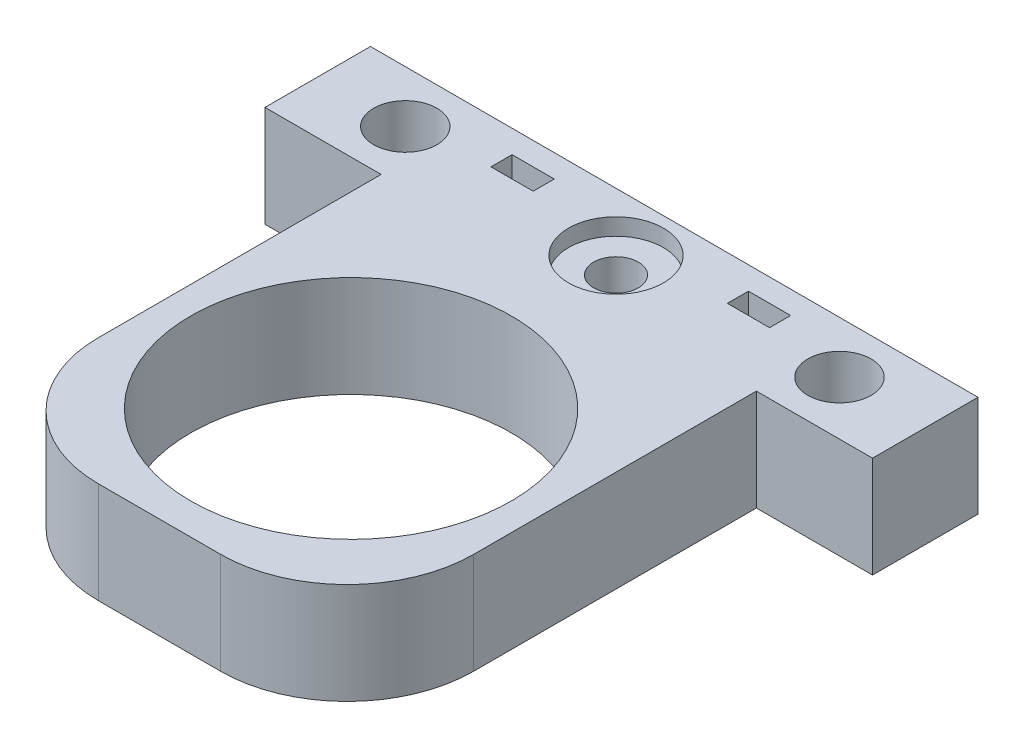
ISO-10303-21;
HEADER;
FILE_DESCRIPTION(('STEP AP214'),'2;1');
FILE_NAME('part.step','',(''),(''),'','','');
FILE_SCHEMA(('AUTOMOTIVE_DESIGN { 1 0 10303 214 1 1 1 1 }'));
ENDSEC;
DATA;
#1=APPLICATION_CONTEXT('core data for automotive mechanical design processes');
#2=APPLICATION_PROTOCOL_DEFINITION('international standard','automotive_design',2000,#1);
#3=PRODUCT_CONTEXT('',#1,'mechanical');
#4=PRODUCT('Part','Part','',(#3));
#5=PRODUCT_RELATED_PRODUCT_CATEGORY('part','',(#4));
#6=PRODUCT_DEFINITION_FORMATION('','',#4);
#7=PRODUCT_DEFINITION_CONTEXT('part definition',#1,'design');
#8=PRODUCT_DEFINITION('design','',#6,#7);
#9=PRODUCT_DEFINITION_SHAPE('','',#8);
#10=(LENGTH_UNIT() NAMED_UNIT(*) SI_UNIT(.MILLI.,.METRE.));
#11=(NAMED_UNIT(*) PLANE_ANGLE_UNIT() SI_UNIT($,.RADIAN.));
#12=(NAMED_UNIT(*) SI_UNIT($,.STERADIAN.) SOLID_ANGLE_UNIT());
#13=UNCERTAINTY_MEASURE_WITH_UNIT(LENGTH_MEASURE(1.E-05),#10,'distance_accuracy_value','');
#14=(GEOMETRIC_REPRESENTATION_CONTEXT(3) GLOBAL_UNCERTAINTY_ASSIGNED_CONTEXT((#13)) GLOBAL_UNIT_ASSIGNED_CONTEXT((#10,
#11,#12)) REPRESENTATION_CONTEXT('',''));
#15=CARTESIAN_POINT('',(0.,0.,0.));
#16=DIRECTION('',(0.,0.,1.));
#17=DIRECTION('',(1.,0.,0.));
#18=AXIS2_PLACEMENT_3D('',#15,#16,#17);
#19=CARTESIAN_POINT('',(0.,20.,-11.2));
#20=DIRECTION('',(0.,1.,0.));
#21=DIRECTION('',(0.,0.,1.));
#22=AXIS2_PLACEMENT_3D('',#19,#20,#21);
#23=CYLINDRICAL_SURFACE('',#22,5.3);
#24=CARTESIAN_POINT('',(0.,20.,-11.2));
#25=DIRECTION('',(0.,1.,0.));
#26=DIRECTION('',(0.,0.,1.));
#27=AXIS2_PLACEMENT_3D('',#24,#25,#26);
#28=CIRCLE('',#27,5.3);
#29=CARTESIAN_POINT('',(0.,20.,-5.90000000000002));
#30=VERTEX_POINT('',#29);
#31=EDGE_CURVE('E172',#30,#30,#28,.T.);
#32=ORIENTED_EDGE('',*,*,#31,.F.);
#33=EDGE_LOOP('',(#32));
#34=FACE_BOUND('',#33,.T.);
#35=CARTESIAN_POINT('',(0.,40.,-11.2));
#36=DIRECTION('',(0.,1.,0.));
#37=DIRECTION('',(0.,0.,1.));
#38=AXIS2_PLACEMENT_3D('',#35,#36,#37);
#39=CIRCLE('',#38,5.3);
#40=CARTESIAN_POINT('',(0.,40.,-5.90000000000002));
#41=VERTEX_POINT('',#40);
#42=EDGE_CURVE('E266',#41,#41,#39,.F.);
#43=ORIENTED_EDGE('',*,*,#42,.F.);
#44=EDGE_LOOP('',(#43));
#45=FACE_BOUND('',#44,.T.);
#46=ADVANCED_FACE('F38',(#34,#45),#23,.F.);
#47=CARTESIAN_POINT('',(-65.,60.,-25.));
#48=DIRECTION('',(0.,0.,1.));
#49=DIRECTION('',(1.,0.,0.));
#50=AXIS2_PLACEMENT_3D('',#47,#48,#49);
#51=PLANE('',#50);
#52=DIRECTION('',(-1.,0.,0.));
#53=VECTOR('',#52,1.);
#54=CARTESIAN_POINT('',(-72.,44.,-25.));
#55=LINE('',#54,#53);
#56=CARTESIAN_POINT('',(72.,44.,-25.));
#57=VERTEX_POINT('',#56);
#58=CARTESIAN_POINT('',(-72.,44.,-25.));
#59=VERTEX_POINT('',#58);
#60=EDGE_CURVE('E168',#57,#59,#55,.T.);
#61=ORIENTED_EDGE('',*,*,#60,.F.);
#62=DIRECTION('',(0.,1.,0.));
#63=VECTOR('',#62,1.);
#64=CARTESIAN_POINT('',(72.,60.,-25.));
#65=LINE('',#64,#63);
#66=CARTESIAN_POINT('',(72.,20.,-25.));
#67=VERTEX_POINT('',#66);
#68=EDGE_CURVE('E198',#67,#57,#65,.T.);
#69=ORIENTED_EDGE('',*,*,#68,.F.);
#70=DIRECTION('',(1.,0.,0.));
#71=VECTOR('',#70,1.);
#72=CARTESIAN_POINT('',(-65.,20.,-25.));
#73=LINE('',#72,#71);
#74=CARTESIAN_POINT('',(-72.,20.,-25.));
#75=VERTEX_POINT('',#74);
#76=EDGE_CURVE('E206',#75,#67,#73,.T.);
#77=ORIENTED_EDGE('',*,*,#76,.F.);
#78=DIRECTION('',(0.,-1.,0.));
#79=VECTOR('',#78,1.);
#80=CARTESIAN_POINT('',(-72.,60.,-25.));
#81=LINE('',#80,#79);
#82=EDGE_CURVE('E192',#59,#75,#81,.T.);
#83=ORIENTED_EDGE('',*,*,#82,.F.);
#84=EDGE_LOOP('',(#61,#69,#77,#83));
#85=FACE_BOUND('',#84,.T.);
#86=ADVANCED_FACE('F306',(#85),#51,.F.);
#87=CARTESIAN_POINT('',(51.4526055476511,0.,-12.7142223868873));
#88=DIRECTION('',(0.,1.,0.));
#89=DIRECTION('',(0.,0.,1.));
#90=AXIS2_PLACEMENT_3D('',#87,#88,#89);
#91=CYLINDRICAL_SURFACE('',#90,7.5);
#92=CARTESIAN_POINT('',(51.4526055476511,20.,-12.7142223868873));
#93=DIRECTION('',(0.,-1.,0.));
#94=DIRECTION('',(0.,0.,-1.));
#95=AXIS2_PLACEMENT_3D('',#92,#93,#94);
#96=CIRCLE('',#95,7.5);
#97=CARTESIAN_POINT('',(51.4526055476511,20.,-20.2142223868873));
#98=VERTEX_POINT('',#97);
#99=EDGE_CURVE('E229',#98,#98,#96,.F.);
#100=ORIENTED_EDGE('',*,*,#99,.F.);
#101=EDGE_LOOP('',(#100));
#102=FACE_BOUND('',#101,.T.);
#103=CARTESIAN_POINT('',(51.4526055476511,44.,-12.7142223868873));
#104=DIRECTION('',(0.,1.,0.));
#105=DIRECTION('',(0.,0.,1.));
#106=AXIS2_PLACEMENT_3D('',#103,#104,#105);
#107=CIRCLE('',#106,7.5);
#108=CARTESIAN_POINT('',(51.4526055476511,44.,-5.21422238688734));
#109=VERTEX_POINT('',#108);
#110=EDGE_CURVE('E334',#109,#109,#107,.F.);
#111=ORIENTED_EDGE('',*,*,#110,.F.);
#112=EDGE_LOOP('',(#111));
#113=FACE_BOUND('',#112,.T.);
#114=ADVANCED_FACE('F339',(#102,#113),#91,.F.);
#115=CARTESIAN_POINT('',(-51.4526055476511,0.,-12.7142223868873));
#116=DIRECTION('',(0.,1.,0.));
#117=DIRECTION('',(0.,0.,1.));
#118=AXIS2_PLACEMENT_3D('',#115,#116,#117);
#119=CYLINDRICAL_SURFACE('',#118,7.5);
#120=CARTESIAN_POINT('',(-51.4526055476511,20.,-12.7142223868873));
#121=DIRECTION('',(0.,-1.,0.));
#122=DIRECTION('',(0.,0.,-1.));
#123=AXIS2_PLACEMENT_3D('',#120,#121,#122);
#124=CIRCLE('',#123,7.5);
#125=CARTESIAN_POINT('',(-51.4526055476511,20.,-20.2142223868873));
#126=VERTEX_POINT('',#125);
#127=EDGE_CURVE('E226',#126,#126,#124,.F.);
#128=ORIENTED_EDGE('',*,*,#127,.F.);
#129=EDGE_LOOP('',(#128));
#130=FACE_BOUND('',#129,.T.);
#131=CARTESIAN_POINT('',(-51.4526055476511,44.,-12.7142223868873));
#132=DIRECTION('',(0.,1.,0.));
#133=DIRECTION('',(0.,0.,1.));
#134=AXIS2_PLACEMENT_3D('',#131,#132,#133);
#135=CIRCLE('',#134,7.5);
#136=CARTESIAN_POINT('',(-51.4526055476511,44.,-5.21422238688734));
#137=VERTEX_POINT('',#136);
#138=EDGE_CURVE('E331',#137,#137,#135,.F.);
#139=ORIENTED_EDGE('',*,*,#138,.F.);
#140=EDGE_LOOP('',(#139));
#141=FACE_BOUND('',#140,.T.);
#142=ADVANCED_FACE('F341',(#130,#141),#119,.F.);
#143=CARTESIAN_POINT('',(-33.01308524261,0.,-19.5794065637342));
#144=DIRECTION('',(-1.,0.,0.));
#145=DIRECTION('',(0.,0.,1.));
#146=AXIS2_PLACEMENT_3D('',#143,#144,#145);
#147=PLANE('',#146);
#148=DIRECTION('',(0.,0.,-1.));
#149=VECTOR('',#148,1.);
#150=CARTESIAN_POINT('',(-33.01308524261,44.,-19.5794065637342));
#151=LINE('',#150,#149);
#152=CARTESIAN_POINT('',(-33.01308524261,44.,-14.5794065637342));
#153=VERTEX_POINT('',#152);
#154=CARTESIAN_POINT('',(-33.01308524261,44.,-19.5794065637342));
#155=VERTEX_POINT('',#154);
#156=EDGE_CURVE('E329',#153,#155,#151,.T.);
#157=ORIENTED_EDGE('',*,*,#156,.F.);
#158=DIRECTION('',(0.,1.,0.));
#159=VECTOR('',#158,1.);
#160=CARTESIAN_POINT('',(-33.01308524261,0.,-14.5794065637342));
#161=LINE('',#160,#159);
#162=CARTESIAN_POINT('',(-33.01308524261,20.,-14.5794065637342));
#163=VERTEX_POINT('',#162);
#164=EDGE_CURVE('E236',#163,#153,#161,.T.);
#165=ORIENTED_EDGE('',*,*,#164,.F.);
#166=DIRECTION('',(0.,0.,1.));
#167=VECTOR('',#166,1.);
#168=CARTESIAN_POINT('',(-33.01308524261,20.,-19.5794065637342));
#169=LINE('',#168,#167);
#170=CARTESIAN_POINT('',(-33.01308524261,20.,-19.5794065637342));
#171=VERTEX_POINT('',#170);
#172=EDGE_CURVE('E224',#171,#163,#169,.T.);
#173=ORIENTED_EDGE('',*,*,#172,.F.);
#174=DIRECTION('',(0.,1.,0.));
#175=VECTOR('',#174,1.);
#176=CARTESIAN_POINT('',(-33.01308524261,0.,-19.5794065637342));
#177=LINE('',#176,#175);
#178=EDGE_CURVE('E245',#171,#155,#177,.T.);
#179=ORIENTED_EDGE('',*,*,#178,.T.);
#180=EDGE_LOOP('',(#157,#165,#173,#179));
#181=FACE_BOUND('',#180,.T.);
#182=ADVANCED_FACE('F348',(#181),#147,.F.);
#183=CARTESIAN_POINT('',(-33.01308524261,0.,-19.5794065637342));
#184=DIRECTION('',(0.,0.,-1.));
#185=DIRECTION('',(-1.,0.,0.));
#186=AXIS2_PLACEMENT_3D('',#183,#184,#185);
#187=PLANE('',#186);
#188=DIRECTION('',(1.,0.,0.));
#189=VECTOR('',#188,1.);
#190=CARTESIAN_POINT('',(-33.01308524261,44.,-19.5794065637342));
#191=LINE('',#190,#189);
#192=CARTESIAN_POINT('',(-23.01308524261,44.,-19.5794065637342));
#193=VERTEX_POINT('',#192);
#194=EDGE_CURVE('E327',#155,#193,#191,.T.);
#195=ORIENTED_EDGE('',*,*,#194,.F.);
#196=ORIENTED_EDGE('',*,*,#178,.F.);
#197=DIRECTION('',(-1.,0.,0.));
#198=VECTOR('',#197,1.);
#199=CARTESIAN_POINT('',(-33.01308524261,20.,-19.5794065637342));
#200=LINE('',#199,#198);
#201=CARTESIAN_POINT('',(-23.01308524261,20.,-19.5794065637342));
#202=VERTEX_POINT('',#201);
#203=EDGE_CURVE('E222',#202,#171,#200,.T.);
#204=ORIENTED_EDGE('',*,*,#203,.F.);
#205=DIRECTION('',(0.,1.,0.));
#206=VECTOR('',#205,1.);
#207=CARTESIAN_POINT('',(-23.01308524261,0.,-19.5794065637342));
#208=LINE('',#207,#206);
#209=EDGE_CURVE('E249',#202,#193,#208,.T.);
#210=ORIENTED_EDGE('',*,*,#209,.T.);
#211=EDGE_LOOP('',(#195,#196,#204,#210));
#212=FACE_BOUND('',#211,.T.);
#213=ADVANCED_FACE('F406',(#212),#187,.F.);
#214=CARTESIAN_POINT('',(-23.01308524261,0.,-19.5794065637342));
#215=DIRECTION('',(1.,0.,0.));
#216=DIRECTION('',(0.,0.,-1.));
#217=AXIS2_PLACEMENT_3D('',#214,#215,#216);
#218=PLANE('',#217);
#219=DIRECTION('',(0.,0.,1.));
#220=VECTOR('',#219,1.);
#221=CARTESIAN_POINT('',(-23.01308524261,44.,-19.5794065637342));
#222=LINE('',#221,#220);
#223=CARTESIAN_POINT('',(-23.01308524261,44.,-14.5794065637342));
#224=VERTEX_POINT('',#223);
#225=EDGE_CURVE('E325',#193,#224,#222,.T.);
#226=ORIENTED_EDGE('',*,*,#225,.F.);
#227=ORIENTED_EDGE('',*,*,#209,.F.);
#228=DIRECTION('',(0.,0.,-1.));
#229=VECTOR('',#228,1.);
#230=CARTESIAN_POINT('',(-23.01308524261,20.,-19.5794065637342));
#231=LINE('',#230,#229);
#232=CARTESIAN_POINT('',(-23.01308524261,20.,-14.5794065637342));
#233=VERTEX_POINT('',#232);
#234=EDGE_CURVE('E220',#233,#202,#231,.T.);
#235=ORIENTED_EDGE('',*,*,#234,.F.);
#236=DIRECTION('',(0.,1.,0.));
#237=VECTOR('',#236,1.);
#238=CARTESIAN_POINT('',(-23.01308524261,0.,-14.5794065637342));
#239=LINE('',#238,#237);
#240=EDGE_CURVE('E252',#233,#224,#239,.T.);
#241=ORIENTED_EDGE('',*,*,#240,.T.);
#242=EDGE_LOOP('',(#226,#227,#235,#241));
#243=FACE_BOUND('',#242,.T.);
#244=ADVANCED_FACE('F409',(#243),#218,.F.);
#245=CARTESIAN_POINT('',(-33.01308524261,0.,-14.5794065637342));
#246=DIRECTION('',(0.,0.,1.));
#247=DIRECTION('',(1.,0.,0.));
#248=AXIS2_PLACEMENT_3D('',#245,#246,#247);
#249=PLANE('',#248);
#250=DIRECTION('',(-1.,0.,0.));
#251=VECTOR('',#250,1.);
#252=CARTESIAN_POINT('',(-33.01308524261,44.,-14.5794065637342));
#253=LINE('',#252,#251);
#254=EDGE_CURVE('E323',#224,#153,#253,.T.);
#255=ORIENTED_EDGE('',*,*,#254,.F.);
#256=ORIENTED_EDGE('',*,*,#240,.F.);
#257=DIRECTION('',(1.,0.,0.));
#258=VECTOR('',#257,1.);
#259=CARTESIAN_POINT('',(-33.01308524261,20.,-14.5794065637342));
#260=LINE('',#259,#258);
#261=EDGE_CURVE('E218',#163,#233,#260,.T.);
#262=ORIENTED_EDGE('',*,*,#261,.F.);
#263=ORIENTED_EDGE('',*,*,#164,.T.);
#264=EDGE_LOOP('',(#255,#256,#262,#263));
#265=FACE_BOUND('',#264,.T.);
#266=ADVANCED_FACE('F404',(#265),#249,.F.);
#267=CARTESIAN_POINT('',(33.01308524261,0.,-19.5794065637342));
#268=DIRECTION('',(0.,0.,-1.));
#269=DIRECTION('',(-1.,0.,0.));
#270=AXIS2_PLACEMENT_3D('',#267,#268,#269);
#271=PLANE('',#270);
#272=DIRECTION('',(1.,0.,0.));
#273=VECTOR('',#272,1.);
#274=CARTESIAN_POINT('',(33.01308524261,44.,-19.5794065637342));
#275=LINE('',#274,#273);
#276=CARTESIAN_POINT('',(23.01308524261,44.,-19.5794065637342));
#277=VERTEX_POINT('',#276);
#278=CARTESIAN_POINT('',(33.01308524261,44.,-19.5794065637342));
#279=VERTEX_POINT('',#278);
#280=EDGE_CURVE('E321',#277,#279,#275,.T.);
#281=ORIENTED_EDGE('',*,*,#280,.F.);
#282=DIRECTION('',(0.,1.,0.));
#283=VECTOR('',#282,1.);
#284=CARTESIAN_POINT('',(23.01308524261,0.,-19.5794065637342));
#285=LINE('',#284,#283);
#286=CARTESIAN_POINT('',(23.01308524261,20.,-19.5794065637342));
#287=VERTEX_POINT('',#286);
#288=EDGE_CURVE('E232',#287,#277,#285,.T.);
#289=ORIENTED_EDGE('',*,*,#288,.F.);
#290=DIRECTION('',(-1.,0.,0.));
#291=VECTOR('',#290,1.);
#292=CARTESIAN_POINT('',(33.01308524261,20.,-19.5794065637342));
#293=LINE('',#292,#291);
#294=CARTESIAN_POINT('',(33.01308524261,20.,-19.5794065637342));
#295=VERTEX_POINT('',#294);
#296=EDGE_CURVE('E216',#295,#287,#293,.T.);
#297=ORIENTED_EDGE('',*,*,#296,.F.);
#298=DIRECTION('',(0.,1.,0.));
#299=VECTOR('',#298,1.);
#300=CARTESIAN_POINT('',(33.01308524261,0.,-19.5794065637342));
#301=LINE('',#300,#299);
#302=EDGE_CURVE('E233',#295,#279,#301,.T.);
#303=ORIENTED_EDGE('',*,*,#302,.T.);
#304=EDGE_LOOP('',(#281,#289,#297,#303));
#305=FACE_BOUND('',#304,.T.);
#306=ADVANCED_FACE('F394',(#305),#271,.F.);
#307=CARTESIAN_POINT('',(33.01308524261,0.,-19.5794065637342));
#308=DIRECTION('',(1.,0.,0.));
#309=DIRECTION('',(0.,0.,-1.));
#310=AXIS2_PLACEMENT_3D('',#307,#308,#309);
#311=PLANE('',#310);
#312=DIRECTION('',(0.,0.,1.));
#313=VECTOR('',#312,1.);
#314=CARTESIAN_POINT('',(33.01308524261,44.,-19.5794065637342));
#315=LINE('',#314,#313);
#316=CARTESIAN_POINT('',(33.01308524261,44.,-14.5794065637342));
#317=VERTEX_POINT('',#316);
#318=EDGE_CURVE('E319',#279,#317,#315,.T.);
#319=ORIENTED_EDGE('',*,*,#318,.F.);
#320=ORIENTED_EDGE('',*,*,#302,.F.);
#321=DIRECTION('',(0.,0.,-1.));
#322=VECTOR('',#321,1.);
#323=CARTESIAN_POINT('',(33.01308524261,20.,-19.5794065637342));
#324=LINE('',#323,#322);
#325=CARTESIAN_POINT('',(33.01308524261,20.,-14.5794065637342));
#326=VERTEX_POINT('',#325);
#327=EDGE_CURVE('E214',#326,#295,#324,.T.);
#328=ORIENTED_EDGE('',*,*,#327,.F.);
#329=DIRECTION('',(0.,1.,0.));
#330=VECTOR('',#329,1.);
#331=CARTESIAN_POINT('',(33.01308524261,0.,-14.5794065637342));
#332=LINE('',#331,#330);
#333=EDGE_CURVE('E237',#326,#317,#332,.T.);
#334=ORIENTED_EDGE('',*,*,#333,.T.);
#335=EDGE_LOOP('',(#319,#320,#328,#334));
#336=FACE_BOUND('',#335,.T.);
#337=ADVANCED_FACE('F390',(#336),#311,.F.);
#338=CARTESIAN_POINT('',(33.01308524261,0.,-14.5794065637342));
#339=DIRECTION('',(0.,0.,1.));
#340=DIRECTION('',(1.,0.,0.));
#341=AXIS2_PLACEMENT_3D('',#338,#339,#340);
#342=PLANE('',#341);
#343=DIRECTION('',(-1.,0.,0.));
#344=VECTOR('',#343,1.);
#345=CARTESIAN_POINT('',(33.01308524261,44.,-14.5794065637342));
#346=LINE('',#345,#344);
#347=CARTESIAN_POINT('',(23.01308524261,44.,-14.5794065637342));
#348=VERTEX_POINT('',#347);
#349=EDGE_CURVE('E317',#317,#348,#346,.T.);
#350=ORIENTED_EDGE('',*,*,#349,.F.);
#351=ORIENTED_EDGE('',*,*,#333,.F.);
#352=DIRECTION('',(1.,0.,0.));
#353=VECTOR('',#352,1.);
#354=CARTESIAN_POINT('',(33.01308524261,20.,-14.5794065637342));
#355=LINE('',#354,#353);
#356=CARTESIAN_POINT('',(23.01308524261,20.,-14.5794065637342));
#357=VERTEX_POINT('',#356);
#358=EDGE_CURVE('E212',#357,#326,#355,.T.);
#359=ORIENTED_EDGE('',*,*,#358,.F.);
#360=DIRECTION('',(0.,1.,0.));
#361=VECTOR('',#360,1.);
#362=CARTESIAN_POINT('',(23.01308524261,0.,-14.5794065637342));
#363=LINE('',#362,#361);
#364=EDGE_CURVE('E240',#357,#348,#363,.T.);
#365=ORIENTED_EDGE('',*,*,#364,.T.);
#366=EDGE_LOOP('',(#350,#351,#359,#365));
#367=FACE_BOUND('',#366,.T.);
#368=ADVANCED_FACE('F393',(#367),#342,.F.);
#369=CARTESIAN_POINT('',(23.01308524261,0.,-19.5794065637342));
#370=DIRECTION('',(-1.,0.,0.));
#371=DIRECTION('',(0.,0.,1.));
#372=AXIS2_PLACEMENT_3D('',#369,#370,#371);
#373=PLANE('',#372);
#374=DIRECTION('',(0.,0.,-1.));
#375=VECTOR('',#374,1.);
#376=CARTESIAN_POINT('',(23.01308524261,44.,-19.5794065637342));
#377=LINE('',#376,#375);
#378=EDGE_CURVE('E181',#348,#277,#377,.T.);
#379=ORIENTED_EDGE('',*,*,#378,.F.);
#380=ORIENTED_EDGE('',*,*,#364,.F.);
#381=DIRECTION('',(0.,0.,1.));
#382=VECTOR('',#381,1.);
#383=CARTESIAN_POINT('',(23.01308524261,20.,-19.5794065637342));
#384=LINE('',#383,#382);
#385=EDGE_CURVE('E210',#287,#357,#384,.T.);
#386=ORIENTED_EDGE('',*,*,#385,.F.);
#387=ORIENTED_EDGE('',*,*,#288,.T.);
#388=EDGE_LOOP('',(#379,#380,#386,#387));
#389=FACE_BOUND('',#388,.T.);
#390=ADVANCED_FACE('F382',(#389),#373,.F.);
#391=CARTESIAN_POINT('',(44.4743587222466,15.,0.));
#392=DIRECTION('',(-1.,0.,0.));
#393=DIRECTION('',(0.,0.,1.));
#394=AXIS2_PLACEMENT_3D('',#391,#392,#393);
#395=PLANE('',#394);
#396=DIRECTION('',(0.,0.,-1.));
#397=VECTOR('',#396,1.);
#398=CARTESIAN_POINT('',(44.4743587222466,44.,0.));
#399=LINE('',#398,#397);
#400=CARTESIAN_POINT('',(44.4743587222466,44.,67.));
#401=VERTEX_POINT('',#400);
#402=CARTESIAN_POINT('',(44.4743587222466,44.,0.));
#403=VERTEX_POINT('',#402);
#404=EDGE_CURVE('E289',#401,#403,#399,.T.);
#405=ORIENTED_EDGE('',*,*,#404,.F.);
#406=DIRECTION('',(0.,1.,0.));
#407=VECTOR('',#406,1.);
#408=CARTESIAN_POINT('',(44.4743587222466,20.,67.));
#409=LINE('',#408,#407);
#410=CARTESIAN_POINT('',(44.4743587222466,20.,67.));
#411=VERTEX_POINT('',#410);
#412=EDGE_CURVE('E11',#401,#411,#409,.F.);
#413=ORIENTED_EDGE('',*,*,#412,.T.);
#414=DIRECTION('',(0.,0.,-1.));
#415=VECTOR('',#414,1.);
#416=CARTESIAN_POINT('',(44.4743587222466,20.,0.));
#417=LINE('',#416,#415);
#418=CARTESIAN_POINT('',(44.4743587222466,20.,0.));
#419=VERTEX_POINT('',#418);
#420=EDGE_CURVE('E259',#411,#419,#417,.T.);
#421=ORIENTED_EDGE('',*,*,#420,.T.);
#422=DIRECTION('',(0.,1.,0.));
#423=VECTOR('',#422,1.);
#424=CARTESIAN_POINT('',(44.4743587222466,15.,0.));
#425=LINE('',#424,#423);
#426=EDGE_CURVE('E204',#419,#403,#425,.T.);
#427=ORIENTED_EDGE('',*,*,#426,.T.);
#428=EDGE_LOOP('',(#405,#413,#421,#427));
#429=FACE_BOUND('',#428,.T.);
#430=ADVANCED_FACE('F379',(#429),#395,.F.);
#431=CARTESIAN_POINT('',(65.,15.,0.));
#432=DIRECTION('',(0.,0.,-1.));
#433=DIRECTION('',(-1.,0.,0.));
#434=AXIS2_PLACEMENT_3D('',#431,#432,#433);
#435=PLANE('',#434);
#436=DIRECTION('',(1.,0.,0.));
#437=VECTOR('',#436,1.);
#438=CARTESIAN_POINT('',(65.,44.,0.));
#439=LINE('',#438,#437);
#440=CARTESIAN_POINT('',(72.,44.,0.));
#441=VERTEX_POINT('',#440);
#442=EDGE_CURVE('E309',#403,#441,#439,.T.);
#443=ORIENTED_EDGE('',*,*,#442,.F.);
#444=ORIENTED_EDGE('',*,*,#426,.F.);
#445=DIRECTION('',(1.,0.,0.));
#446=VECTOR('',#445,1.);
#447=CARTESIAN_POINT('',(0.,20.,0.));
#448=LINE('',#447,#446);
#449=CARTESIAN_POINT('',(72.,20.,0.));
#450=VERTEX_POINT('',#449);
#451=EDGE_CURVE('E248',#419,#450,#448,.T.);
#452=ORIENTED_EDGE('',*,*,#451,.T.);
#453=DIRECTION('',(0.,-1.,0.));
#454=VECTOR('',#453,1.);
#455=CARTESIAN_POINT('',(72.,60.,0.));
#456=LINE('',#455,#454);
#457=EDGE_CURVE('E188',#441,#450,#456,.T.);
#458=ORIENTED_EDGE('',*,*,#457,.F.);
#459=EDGE_LOOP('',(#443,#444,#452,#458));
#460=FACE_BOUND('',#459,.T.);
#461=ADVANCED_FACE('F376',(#460),#435,.F.);
#462=CARTESIAN_POINT('',(-65.,15.,0.));
#463=DIRECTION('',(0.,0.,-1.));
#464=DIRECTION('',(-1.,0.,0.));
#465=AXIS2_PLACEMENT_3D('',#462,#463,#464);
#466=PLANE('',#465);
#467=DIRECTION('',(1.,0.,0.));
#468=VECTOR('',#467,1.);
#469=CARTESIAN_POINT('',(-65.,44.,0.));
#470=LINE('',#469,#468);
#471=CARTESIAN_POINT('',(-72.,44.,0.));
#472=VERTEX_POINT('',#471);
#473=CARTESIAN_POINT('',(-44.4743587222466,44.,0.));
#474=VERTEX_POINT('',#473);
#475=EDGE_CURVE('E166',#472,#474,#470,.T.);
#476=ORIENTED_EDGE('',*,*,#475,.F.);
#477=DIRECTION('',(0.,1.,0.));
#478=VECTOR('',#477,1.);
#479=CARTESIAN_POINT('',(-72.,60.,0.));
#480=LINE('',#479,#478);
#481=CARTESIAN_POINT('',(-72.,20.,0.));
#482=VERTEX_POINT('',#481);
#483=EDGE_CURVE('E179',#482,#472,#480,.T.);
#484=ORIENTED_EDGE('',*,*,#483,.F.);
#485=DIRECTION('',(1.,0.,0.));
#486=VECTOR('',#485,1.);
#487=CARTESIAN_POINT('',(0.,20.,0.));
#488=LINE('',#487,#486);
#489=CARTESIAN_POINT('',(-44.4743587222466,20.,0.));
#490=VERTEX_POINT('',#489);
#491=EDGE_CURVE('E263',#482,#490,#488,.T.);
#492=ORIENTED_EDGE('',*,*,#491,.T.);
#493=DIRECTION('',(0.,1.,0.));
#494=VECTOR('',#493,1.);
#495=CARTESIAN_POINT('',(-44.4743587222466,15.,0.));
#496=LINE('',#495,#494);
#497=EDGE_CURVE('E180',#490,#474,#496,.T.);
#498=ORIENTED_EDGE('',*,*,#497,.T.);
#499=EDGE_LOOP('',(#476,#484,#492,#498));
#500=FACE_BOUND('',#499,.T.);
#501=ADVANCED_FACE('F177',(#500),#466,.F.);
#502=CARTESIAN_POINT('',(-44.4743587222466,15.,0.));
#503=DIRECTION('',(1.,0.,0.));
#504=DIRECTION('',(0.,0.,-1.));
#505=AXIS2_PLACEMENT_3D('',#502,#503,#504);
#506=PLANE('',#505);
#507=DIRECTION('',(0.,0.,1.));
#508=VECTOR('',#507,1.);
#509=CARTESIAN_POINT('',(-44.4743587222466,20.,0.));
#510=LINE('',#509,#508);
#511=CARTESIAN_POINT('',(-44.4743587222466,20.,67.));
#512=VERTEX_POINT('',#511);
#513=EDGE_CURVE('E261',#490,#512,#510,.T.);
#514=ORIENTED_EDGE('',*,*,#513,.T.);
#515=DIRECTION('',(0.,-1.,0.));
#516=VECTOR('',#515,1.);
#517=CARTESIAN_POINT('',(-44.4743587222466,44.,67.));
#518=LINE('',#517,#516);
#519=CARTESIAN_POINT('',(-44.4743587222466,44.,67.));
#520=VERTEX_POINT('',#519);
#521=EDGE_CURVE('E61',#512,#520,#518,.F.);
#522=ORIENTED_EDGE('',*,*,#521,.T.);
#523=DIRECTION('',(0.,0.,1.));
#524=VECTOR('',#523,1.);
#525=CARTESIAN_POINT('',(-44.4743587222466,44.,0.));
#526=LINE('',#525,#524);
#527=EDGE_CURVE('E182',#474,#520,#526,.T.);
#528=ORIENTED_EDGE('',*,*,#527,.F.);
#529=ORIENTED_EDGE('',*,*,#497,.F.);
#530=EDGE_LOOP('',(#514,#522,#528,#529));
#531=FACE_BOUND('',#530,.T.);
#532=ADVANCED_FACE('F296',(#531),#506,.F.);
#533=CARTESIAN_POINT('',(0.,0.,97.));
#534=DIRECTION('',(0.,0.,1.));
#535=DIRECTION('',(1.,0.,0.));
#536=AXIS2_PLACEMENT_3D('',#533,#534,#535);
#537=PLANE('',#536);
#538=DIRECTION('',(-1.,0.,0.));
#539=VECTOR('',#538,1.);
#540=CARTESIAN_POINT('',(0.,44.,97.));
#541=LINE('',#540,#539);
#542=CARTESIAN_POINT('',(14.4743587222466,44.,97.));
#543=VERTEX_POINT('',#542);
#544=CARTESIAN_POINT('',(-14.4743587222466,44.,97.));
#545=VERTEX_POINT('',#544);
#546=EDGE_CURVE('E282',#543,#545,#541,.T.);
#547=ORIENTED_EDGE('',*,*,#546,.T.);
#548=DIRECTION('',(0.,-1.,0.));
#549=VECTOR('',#548,1.);
#550=CARTESIAN_POINT('',(-14.4743587222466,20.,97.));
#551=LINE('',#550,#549);
#552=CARTESIAN_POINT('',(-14.4743587222466,20.,97.));
#553=VERTEX_POINT('',#552);
#554=EDGE_CURVE('E272',#545,#553,#551,.T.);
#555=ORIENTED_EDGE('',*,*,#554,.T.);
#556=DIRECTION('',(1.,0.,0.));
#557=VECTOR('',#556,1.);
#558=CARTESIAN_POINT('',(-44.4743587222466,20.,97.));
#559=LINE('',#558,#557);
#560=CARTESIAN_POINT('',(14.4743587222466,20.,97.));
#561=VERTEX_POINT('',#560);
#562=EDGE_CURVE('E201',#553,#561,#559,.T.);
#563=ORIENTED_EDGE('',*,*,#562,.T.);
#564=DIRECTION('',(0.,1.,0.));
#565=VECTOR('',#564,1.);
#566=CARTESIAN_POINT('',(14.4743587222466,44.,97.));
#567=LINE('',#566,#565);
#568=EDGE_CURVE('E265',#561,#543,#567,.T.);
#569=ORIENTED_EDGE('',*,*,#568,.T.);
#570=EDGE_LOOP('',(#547,#555,#563,#569));
#571=FACE_BOUND('',#570,.T.);
#572=ADVANCED_FACE('F286',(#571),#537,.T.);
#573=CARTESIAN_POINT('',(72.,0.,0.));
#574=DIRECTION('',(1.,0.,0.));
#575=DIRECTION('',(0.,0.,-1.));
#576=AXIS2_PLACEMENT_3D('',#573,#574,#575);
#577=PLANE('',#576);
#578=ORIENTED_EDGE('',*,*,#68,.T.);
#579=DIRECTION('',(0.,0.,1.));
#580=VECTOR('',#579,1.);
#581=CARTESIAN_POINT('',(72.,44.,0.));
#582=LINE('',#581,#580);
#583=EDGE_CURVE('E307',#57,#441,#582,.T.);
#584=ORIENTED_EDGE('',*,*,#583,.T.);
#585=ORIENTED_EDGE('',*,*,#457,.T.);
#586=DIRECTION('',(0.,0.,-1.));
#587=VECTOR('',#586,1.);
#588=CARTESIAN_POINT('',(72.,20.,0.));
#589=LINE('',#588,#587);
#590=EDGE_CURVE('E190',#450,#67,#589,.T.);
#591=ORIENTED_EDGE('',*,*,#590,.T.);
#592=EDGE_LOOP('',(#578,#584,#585,#591));
#593=FACE_BOUND('',#592,.T.);
#594=ADVANCED_FACE('F303',(#593),#577,.T.);
#595=CARTESIAN_POINT('',(-72.,0.,0.));
#596=DIRECTION('',(-1.,0.,0.));
#597=DIRECTION('',(0.,0.,1.));
#598=AXIS2_PLACEMENT_3D('',#595,#596,#597);
#599=PLANE('',#598);
#600=ORIENTED_EDGE('',*,*,#483,.T.);
#601=DIRECTION('',(0.,0.,1.));
#602=VECTOR('',#601,1.);
#603=CARTESIAN_POINT('',(-72.,44.,-25.));
#604=LINE('',#603,#602);
#605=EDGE_CURVE('E162',#59,#472,#604,.T.);
#606=ORIENTED_EDGE('',*,*,#605,.F.);
#607=ORIENTED_EDGE('',*,*,#82,.T.);
#608=DIRECTION('',(0.,0.,1.));
#609=VECTOR('',#608,1.);
#610=CARTESIAN_POINT('',(-72.,20.,-25.));
#611=LINE('',#610,#609);
#612=EDGE_CURVE('E187',#75,#482,#611,.T.);
#613=ORIENTED_EDGE('',*,*,#612,.T.);
#614=EDGE_LOOP('',(#600,#606,#607,#613));
#615=FACE_BOUND('',#614,.T.);
#616=ADVANCED_FACE('F185',(#615),#599,.T.);
#617=CARTESIAN_POINT('',(0.,20.,0.));
#618=DIRECTION('',(0.,-1.,0.));
#619=DIRECTION('',(0.,0.,-1.));
#620=AXIS2_PLACEMENT_3D('',#617,#618,#619);
#621=PLANE('',#620);
#622=CARTESIAN_POINT('',(0.,20.,51.5965043695381));
#623=DIRECTION('',(0.,1.,0.));
#624=DIRECTION('',(0.,0.,1.));
#625=AXIS2_PLACEMENT_3D('',#622,#623,#624);
#626=CIRCLE('',#625,38.);
#627=CARTESIAN_POINT('',(0.,20.,89.5965043695381));
#628=VERTEX_POINT('',#627);
#629=EDGE_CURVE('E648',#628,#628,#626,.T.);
#630=ORIENTED_EDGE('',*,*,#629,.T.);
#631=EDGE_LOOP('',(#630));
#632=FACE_BOUND('',#631,.T.);
#633=ORIENTED_EDGE('',*,*,#31,.T.);
#634=EDGE_LOOP('',(#633));
#635=FACE_BOUND('',#634,.T.);
#636=ORIENTED_EDGE('',*,*,#562,.F.);
#637=CARTESIAN_POINT('',(-14.4743587222466,20.,67.));
#638=DIRECTION('',(0.,-1.,0.));
#639=DIRECTION('',(0.,0.,-1.));
#640=AXIS2_PLACEMENT_3D('',#637,#638,#639);
#641=CIRCLE('',#640,30.);
#642=EDGE_CURVE('E277',#553,#512,#641,.T.);
#643=ORIENTED_EDGE('',*,*,#642,.T.);
#644=ORIENTED_EDGE('',*,*,#513,.F.);
#645=ORIENTED_EDGE('',*,*,#491,.F.);
#646=ORIENTED_EDGE('',*,*,#612,.F.);
#647=ORIENTED_EDGE('',*,*,#76,.T.);
#648=ORIENTED_EDGE('',*,*,#590,.F.);
#649=ORIENTED_EDGE('',*,*,#451,.F.);
#650=ORIENTED_EDGE('',*,*,#420,.F.);
#651=CARTESIAN_POINT('',(14.4743587222466,20.,67.));
#652=DIRECTION('',(0.,-1.,0.));
#653=DIRECTION('',(0.,0.,-1.));
#654=AXIS2_PLACEMENT_3D('',#651,#652,#653);
#655=CIRCLE('',#654,30.);
#656=EDGE_CURVE('E275',#411,#561,#655,.T.);
#657=ORIENTED_EDGE('',*,*,#656,.T.);
#658=EDGE_LOOP('',(#636,#643,#644,#645,#646,#647,#648,#649,#650,#657));
#659=FACE_BOUND('',#658,.T.);
#660=ORIENTED_EDGE('',*,*,#296,.T.);
#661=ORIENTED_EDGE('',*,*,#385,.T.);
#662=ORIENTED_EDGE('',*,*,#358,.T.);
#663=ORIENTED_EDGE('',*,*,#327,.T.);
#664=EDGE_LOOP('',(#660,#661,#662,#663));
#665=FACE_BOUND('',#664,.T.);
#666=ORIENTED_EDGE('',*,*,#172,.T.);
#667=ORIENTED_EDGE('',*,*,#261,.T.);
#668=ORIENTED_EDGE('',*,*,#234,.T.);
#669=ORIENTED_EDGE('',*,*,#203,.T.);
#670=EDGE_LOOP('',(#666,#667,#668,#669));
#671=FACE_BOUND('',#670,.T.);
#672=ORIENTED_EDGE('',*,*,#127,.T.);
#673=EDGE_LOOP('',(#672));
#674=FACE_BOUND('',#673,.T.);
#675=ORIENTED_EDGE('',*,*,#99,.T.);
#676=EDGE_LOOP('',(#675));
#677=FACE_BOUND('',#676,.T.);
#678=ADVANCED_FACE('F294',(#632,#635,#659,#665,#671,#674,#677),#621,.T.);
#679=CARTESIAN_POINT('',(0.,44.,0.));
#680=DIRECTION('',(0.,1.,0.));
#681=DIRECTION('',(0.,0.,1.));
#682=AXIS2_PLACEMENT_3D('',#679,#680,#681);
#683=PLANE('',#682);
#684=CARTESIAN_POINT('',(0.,44.,51.5965043695381));
#685=DIRECTION('',(0.,1.,0.));
#686=DIRECTION('',(0.,0.,1.));
#687=AXIS2_PLACEMENT_3D('',#684,#685,#686);
#688=CIRCLE('',#687,38.);
#689=CARTESIAN_POINT('',(0.,44.,89.5965043695381));
#690=VERTEX_POINT('',#689);
#691=EDGE_CURVE('E651',#690,#690,#688,.T.);
#692=ORIENTED_EDGE('',*,*,#691,.F.);
#693=EDGE_LOOP('',(#692));
#694=FACE_BOUND('',#693,.T.);
#695=CARTESIAN_POINT('',(0.,44.,-11.2));
#696=DIRECTION('',(0.,1.,0.));
#697=DIRECTION('',(0.,0.,1.));
#698=AXIS2_PLACEMENT_3D('',#695,#696,#697);
#699=CIRCLE('',#698,11.25);
#700=CARTESIAN_POINT('',(0.,44.,0.0499999999999858));
#701=VERTEX_POINT('',#700);
#702=EDGE_CURVE('E653',#701,#701,#699,.T.);
#703=ORIENTED_EDGE('',*,*,#702,.F.);
#704=EDGE_LOOP('',(#703));
#705=FACE_BOUND('',#704,.T.);
#706=ORIENTED_EDGE('',*,*,#280,.T.);
#707=ORIENTED_EDGE('',*,*,#318,.T.);
#708=ORIENTED_EDGE('',*,*,#349,.T.);
#709=ORIENTED_EDGE('',*,*,#378,.T.);
#710=EDGE_LOOP('',(#706,#707,#708,#709));
#711=FACE_BOUND('',#710,.T.);
#712=ORIENTED_EDGE('',*,*,#527,.T.);
#713=CARTESIAN_POINT('',(-14.4743587222466,44.,67.));
#714=DIRECTION('',(0.,1.,0.));
#715=DIRECTION('',(0.,0.,1.));
#716=AXIS2_PLACEMENT_3D('',#713,#714,#715);
#717=CIRCLE('',#716,30.);
#718=EDGE_CURVE('E46',#520,#545,#717,.T.);
#719=ORIENTED_EDGE('',*,*,#718,.T.);
#720=ORIENTED_EDGE('',*,*,#546,.F.);
#721=CARTESIAN_POINT('',(14.4743587222466,44.,67.));
#722=DIRECTION('',(0.,1.,0.));
#723=DIRECTION('',(0.,0.,1.));
#724=AXIS2_PLACEMENT_3D('',#721,#722,#723);
#725=CIRCLE('',#724,30.);
#726=EDGE_CURVE('E53',#543,#401,#725,.T.);
#727=ORIENTED_EDGE('',*,*,#726,.T.);
#728=ORIENTED_EDGE('',*,*,#404,.T.);
#729=ORIENTED_EDGE('',*,*,#442,.T.);
#730=ORIENTED_EDGE('',*,*,#583,.F.);
#731=ORIENTED_EDGE('',*,*,#60,.T.);
#732=ORIENTED_EDGE('',*,*,#605,.T.);
#733=ORIENTED_EDGE('',*,*,#475,.T.);
#734=EDGE_LOOP('',(#712,#719,#720,#727,#728,#729,#730,#731,#732,#733));
#735=FACE_BOUND('',#734,.T.);
#736=ORIENTED_EDGE('',*,*,#156,.T.);
#737=ORIENTED_EDGE('',*,*,#194,.T.);
#738=ORIENTED_EDGE('',*,*,#225,.T.);
#739=ORIENTED_EDGE('',*,*,#254,.T.);
#740=EDGE_LOOP('',(#736,#737,#738,#739));
#741=FACE_BOUND('',#740,.T.);
#742=ORIENTED_EDGE('',*,*,#138,.T.);
#743=EDGE_LOOP('',(#742));
#744=FACE_BOUND('',#743,.T.);
#745=ORIENTED_EDGE('',*,*,#110,.T.);
#746=EDGE_LOOP('',(#745));
#747=FACE_BOUND('',#746,.T.);
#748=ADVANCED_FACE('F164',(#694,#705,#711,#735,#741,#744,#747),#683,.T.);
#749=CARTESIAN_POINT('',(0.,40.,-11.2));
#750=DIRECTION('',(0.,1.,0.));
#751=DIRECTION('',(0.,0.,1.));
#752=AXIS2_PLACEMENT_3D('',#749,#750,#751);
#753=PLANE('',#752);
#754=CARTESIAN_POINT('',(0.,40.,-11.2));
#755=DIRECTION('',(0.,1.,0.));
#756=DIRECTION('',(0.,0.,1.));
#757=AXIS2_PLACEMENT_3D('',#754,#755,#756);
#758=CIRCLE('',#757,11.25);
#759=CARTESIAN_POINT('',(0.,40.,0.0499999999999858));
#760=VERTEX_POINT('',#759);
#761=EDGE_CURVE('E269',#760,#760,#758,.T.);
#762=ORIENTED_EDGE('',*,*,#761,.T.);
#763=EDGE_LOOP('',(#762));
#764=FACE_BOUND('',#763,.T.);
#765=ORIENTED_EDGE('',*,*,#42,.T.);
#766=EDGE_LOOP('',(#765));
#767=FACE_BOUND('',#766,.T.);
#768=ADVANCED_FACE('F366',(#764,#767),#753,.T.);
#769=CARTESIAN_POINT('',(0.,40.,-11.2));
#770=DIRECTION('',(0.,1.,0.));
#771=DIRECTION('',(0.,0.,1.));
#772=AXIS2_PLACEMENT_3D('',#769,#770,#771);
#773=CYLINDRICAL_SURFACE('',#772,11.25);
#774=ORIENTED_EDGE('',*,*,#761,.F.);
#775=EDGE_LOOP('',(#774));
#776=FACE_BOUND('',#775,.T.);
#777=ORIENTED_EDGE('',*,*,#702,.T.);
#778=EDGE_LOOP('',(#777));
#779=FACE_BOUND('',#778,.T.);
#780=ADVANCED_FACE('F362',(#776,#779),#773,.F.);
#781=CARTESIAN_POINT('',(0.,20.,51.5965043695381));
#782=DIRECTION('',(0.,1.,0.));
#783=DIRECTION('',(0.,0.,1.));
#784=AXIS2_PLACEMENT_3D('',#781,#782,#783);
#785=CYLINDRICAL_SURFACE('',#784,38.);
#786=ORIENTED_EDGE('',*,*,#629,.F.);
#787=EDGE_LOOP('',(#786));
#788=FACE_BOUND('',#787,.T.);
#789=ORIENTED_EDGE('',*,*,#691,.T.);
#790=EDGE_LOOP('',(#789));
#791=FACE_BOUND('',#790,.T.);
#792=ADVANCED_FACE('F520',(#788,#791),#785,.F.);
#793=CARTESIAN_POINT('',(-14.4743587222466,0.,67.));
#794=DIRECTION('',(0.,1.,0.));
#795=DIRECTION('',(0.,0.,1.));
#796=AXIS2_PLACEMENT_3D('',#793,#794,#795);
#797=CYLINDRICAL_SURFACE('',#796,30.);
#798=ORIENTED_EDGE('',*,*,#718,.F.);
#799=ORIENTED_EDGE('',*,*,#521,.F.);
#800=ORIENTED_EDGE('',*,*,#642,.F.);
#801=ORIENTED_EDGE('',*,*,#554,.F.);
#802=EDGE_LOOP('',(#798,#799,#800,#801));
#803=FACE_BOUND('',#802,.T.);
#804=ADVANCED_FACE('F291',(#803),#797,.T.);
#805=CARTESIAN_POINT('',(14.4743587222466,0.,67.));
#806=DIRECTION('',(0.,-1.,0.));
#807=DIRECTION('',(0.,0.,-1.));
#808=AXIS2_PLACEMENT_3D('',#805,#806,#807);
#809=CYLINDRICAL_SURFACE('',#808,30.);
#810=ORIENTED_EDGE('',*,*,#656,.F.);
#811=ORIENTED_EDGE('',*,*,#412,.F.);
#812=ORIENTED_EDGE('',*,*,#726,.F.);
#813=ORIENTED_EDGE('',*,*,#568,.F.);
#814=EDGE_LOOP('',(#810,#811,#812,#813));
#815=FACE_BOUND('',#814,.T.);
#816=ADVANCED_FACE('F40',(#815),#809,.T.);
#817=CLOSED_SHELL('',(#46,#86,#114,#142,#182,#213,#244,#266,#306,#337,#368,#390,#430,#461,#501,
#532,#572,#594,#616,#678,#748,#768,#780,#792,#804,#816));
#818=MANIFOLD_SOLID_BREP('B2',#817);
#819=ADVANCED_BREP_SHAPE_REPRESENTATION('',(#18,#818),#14);
#820=SHAPE_DEFINITION_REPRESENTATION(#9,#819);
ENDSEC;
END-ISO-10303-21;
